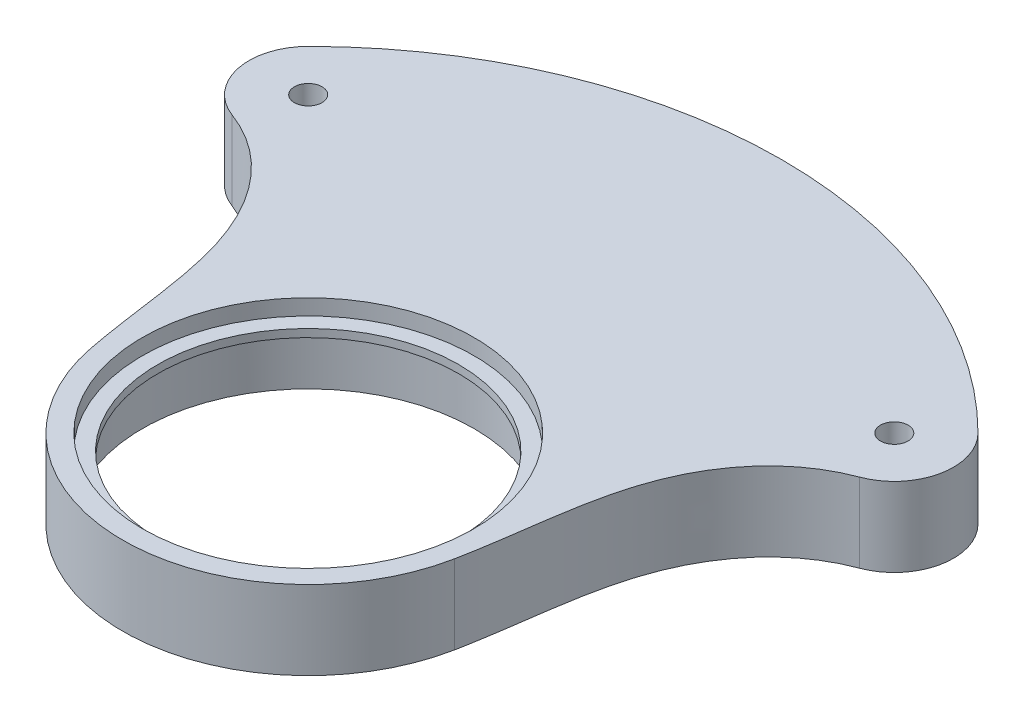
ISO-10303-21;
HEADER;
FILE_DESCRIPTION(('STEP AP214'),'2;1');
FILE_NAME('part.step','',(''),(''),'','','');
FILE_SCHEMA(('AUTOMOTIVE_DESIGN { 1 0 10303 214 1 1 1 1 }'));
ENDSEC;
DATA;
#1=APPLICATION_CONTEXT('core data for automotive mechanical design processes');
#2=APPLICATION_PROTOCOL_DEFINITION('international standard','automotive_design',2000,#1);
#3=PRODUCT_CONTEXT('',#1,'mechanical');
#4=PRODUCT('Part','Part','',(#3));
#5=PRODUCT_RELATED_PRODUCT_CATEGORY('part','',(#4));
#6=PRODUCT_DEFINITION_FORMATION('','',#4);
#7=PRODUCT_DEFINITION_CONTEXT('part definition',#1,'design');
#8=PRODUCT_DEFINITION('design','',#6,#7);
#9=PRODUCT_DEFINITION_SHAPE('','',#8);
#10=(LENGTH_UNIT() NAMED_UNIT(*) SI_UNIT(.MILLI.,.METRE.));
#11=(NAMED_UNIT(*) PLANE_ANGLE_UNIT() SI_UNIT($,.RADIAN.));
#12=(NAMED_UNIT(*) SI_UNIT($,.STERADIAN.) SOLID_ANGLE_UNIT());
#13=UNCERTAINTY_MEASURE_WITH_UNIT(LENGTH_MEASURE(1.E-05),#10,'distance_accuracy_value','');
#14=(GEOMETRIC_REPRESENTATION_CONTEXT(3) GLOBAL_UNCERTAINTY_ASSIGNED_CONTEXT((#13)) GLOBAL_UNIT_ASSIGNED_CONTEXT((#10,
#11,#12)) REPRESENTATION_CONTEXT('',''));
#15=CARTESIAN_POINT('',(0.,0.,0.));
#16=DIRECTION('',(0.,0.,1.));
#17=DIRECTION('',(1.,0.,0.));
#18=AXIS2_PLACEMENT_3D('',#15,#16,#17);
#19=CARTESIAN_POINT('',(0.,10.,0.));
#20=DIRECTION('',(0.,-1.,0.));
#21=DIRECTION('',(0.,0.,-1.));
#22=AXIS2_PLACEMENT_3D('',#19,#20,#21);
#23=CYLINDRICAL_SURFACE('',#22,21.);
#24=CARTESIAN_POINT('',(0.,8.,0.));
#25=DIRECTION('',(0.,1.,0.));
#26=DIRECTION('',(0.,0.,1.));
#27=AXIS2_PLACEMENT_3D('',#24,#25,#26);
#28=CIRCLE('',#27,21.);
#29=CARTESIAN_POINT('',(0.,8.,21.));
#30=VERTEX_POINT('',#29);
#31=EDGE_CURVE('E12',#30,#30,#28,.T.);
#32=ORIENTED_EDGE('',*,*,#31,.F.);
#33=EDGE_LOOP('',(#32));
#34=FACE_BOUND('',#33,.T.);
#35=CARTESIAN_POINT('',(0.,10.,0.));
#36=DIRECTION('',(0.,1.,0.));
#37=DIRECTION('',(0.,0.,1.));
#38=AXIS2_PLACEMENT_3D('',#35,#36,#37);
#39=CIRCLE('',#38,21.);
#40=CARTESIAN_POINT('',(0.,10.,21.));
#41=VERTEX_POINT('',#40);
#42=EDGE_CURVE('E308',#41,#41,#39,.T.);
#43=ORIENTED_EDGE('',*,*,#42,.T.);
#44=EDGE_LOOP('',(#43));
#45=FACE_BOUND('',#44,.T.);
#46=ADVANCED_FACE('F158',(#34,#45),#23,.F.);
#47=CARTESIAN_POINT('',(37.1231060122938,10.,-37.1231060122937));
#48=DIRECTION('',(0.,-1.,0.));
#49=DIRECTION('',(0.,0.,-1.));
#50=AXIS2_PLACEMENT_3D('',#47,#48,#49);
#51=CYLINDRICAL_SURFACE('',#50,7.5);
#52=CARTESIAN_POINT('',(37.1231060122938,0.,-37.1231060122937));
#53=DIRECTION('',(0.,1.,0.));
#54=DIRECTION('',(0.,0.,1.));
#55=AXIS2_PLACEMENT_3D('',#52,#53,#54);
#56=CIRCLE('',#55,7.5);
#57=CARTESIAN_POINT('',(42.4264068711929,0.,-42.4264068711928));
#58=VERTEX_POINT('',#57);
#59=CARTESIAN_POINT('',(39.7420017030734,0.,-30.0952055177778));
#60=VERTEX_POINT('',#59);
#61=EDGE_CURVE('E290',#58,#60,#56,.F.);
#62=ORIENTED_EDGE('',*,*,#61,.F.);
#63=DIRECTION('',(0.,-1.,0.));
#64=VECTOR('',#63,1.);
#65=CARTESIAN_POINT('',(42.4264068711929,10.,-42.4264068711928));
#66=LINE('',#65,#64);
#67=CARTESIAN_POINT('',(42.4264068711929,10.,-42.4264068711928));
#68=VERTEX_POINT('',#67);
#69=EDGE_CURVE('E285',#68,#58,#66,.T.);
#70=ORIENTED_EDGE('',*,*,#69,.F.);
#71=CARTESIAN_POINT('',(37.1231060122938,10.,-37.1231060122937));
#72=DIRECTION('',(0.,1.,0.));
#73=DIRECTION('',(0.,0.,1.));
#74=AXIS2_PLACEMENT_3D('',#71,#72,#73);
#75=CIRCLE('',#74,7.5);
#76=CARTESIAN_POINT('',(39.7420017030734,10.,-30.0952055177778));
#77=VERTEX_POINT('',#76);
#78=EDGE_CURVE('E241',#68,#77,#75,.F.);
#79=ORIENTED_EDGE('',*,*,#78,.T.);
#80=DIRECTION('',(0.,-1.,0.));
#81=VECTOR('',#80,1.);
#82=CARTESIAN_POINT('',(39.7420017030734,10.,-30.0952055177778));
#83=LINE('',#82,#81);
#84=EDGE_CURVE('E204',#77,#60,#83,.T.);
#85=ORIENTED_EDGE('',*,*,#84,.T.);
#86=EDGE_LOOP('',(#62,#70,#79,#85));
#87=FACE_BOUND('',#86,.T.);
#88=ADVANCED_FACE('F264',(#87),#51,.T.);
#89=CARTESIAN_POINT('',(0.,10.,0.));
#90=DIRECTION('',(0.,-1.,0.));
#91=DIRECTION('',(0.,0.,-1.));
#92=AXIS2_PLACEMENT_3D('',#89,#90,#91);
#93=CYLINDRICAL_SURFACE('',#92,60.);
#94=CARTESIAN_POINT('',(0.,0.,0.));
#95=DIRECTION('',(0.,1.,0.));
#96=DIRECTION('',(0.,0.,1.));
#97=AXIS2_PLACEMENT_3D('',#94,#95,#96);
#98=CIRCLE('',#97,60.);
#99=CARTESIAN_POINT('',(-42.4264068711929,0.,-42.4264068711928));
#100=VERTEX_POINT('',#99);
#101=EDGE_CURVE('E294',#58,#100,#98,.T.);
#102=ORIENTED_EDGE('',*,*,#101,.T.);
#103=DIRECTION('',(0.,-1.,0.));
#104=VECTOR('',#103,1.);
#105=CARTESIAN_POINT('',(-42.4264068711929,10.,-42.4264068711928));
#106=LINE('',#105,#104);
#107=CARTESIAN_POINT('',(-42.4264068711929,10.,-42.4264068711928));
#108=VERTEX_POINT('',#107);
#109=EDGE_CURVE('E226',#108,#100,#106,.T.);
#110=ORIENTED_EDGE('',*,*,#109,.F.);
#111=CARTESIAN_POINT('',(0.,10.,0.));
#112=DIRECTION('',(0.,1.,0.));
#113=DIRECTION('',(0.,0.,1.));
#114=AXIS2_PLACEMENT_3D('',#111,#112,#113);
#115=CIRCLE('',#114,60.);
#116=EDGE_CURVE('E235',#68,#108,#115,.T.);
#117=ORIENTED_EDGE('',*,*,#116,.F.);
#118=ORIENTED_EDGE('',*,*,#69,.T.);
#119=EDGE_LOOP('',(#102,#110,#117,#118));
#120=FACE_BOUND('',#119,.T.);
#121=ADVANCED_FACE('F259',(#120),#93,.T.);
#122=CARTESIAN_POINT('',(-39.7420017030734,10.,-30.0952055177778));
#123=CARTESIAN_POINT('',(-34.3086039999246,10.,-28.0704896240095));
#124=CARTESIAN_POINT('',(-24.8133315955259,10.,-17.3717825968528));
#125=CARTESIAN_POINT('',(-24.750821327595,10.,-4.07439581543046));
#126=CARTESIAN_POINT('',(-23.0586272785893,10.,4.53317857877841));
#127=B_SPLINE_CURVE_WITH_KNOTS('',3,(#122,#123,#124,#125,#126),.UNSPECIFIED.,.F.,.F.,(4,1,4),
(0.,0.392292763126498,1.),.UNSPECIFIED.);
#128=DIRECTION('',(0.,-1.,0.));
#129=VECTOR('',#128,1.);
#130=SURFACE_OF_LINEAR_EXTRUSION('',#127,#129);
#131=CARTESIAN_POINT('',(-39.7420017030734,0.,-30.0952055177778));
#132=CARTESIAN_POINT('',(-34.3086039999246,0.,-28.0704896240095));
#133=CARTESIAN_POINT('',(-24.8133315955259,0.,-17.3717825968528));
#134=CARTESIAN_POINT('',(-24.750821327595,0.,-4.07439581543046));
#135=CARTESIAN_POINT('',(-23.0586272785893,0.,4.53317857877841));
#136=B_SPLINE_CURVE_WITH_KNOTS('',3,(#131,#132,#133,#134,#135),.UNSPECIFIED.,.F.,.F.,(4,1,4),
(0.,0.392292763126498,1.),.UNSPECIFIED.);
#137=CARTESIAN_POINT('',(-39.7420017030734,0.,-30.0952055177778));
#138=VERTEX_POINT('',#137);
#139=CARTESIAN_POINT('',(-23.0586272785893,0.,4.53317857877841));
#140=VERTEX_POINT('',#139);
#141=EDGE_CURVE('E277',#138,#140,#136,.T.);
#142=ORIENTED_EDGE('',*,*,#141,.T.);
#143=DIRECTION('',(0.,-1.,0.));
#144=VECTOR('',#143,1.);
#145=CARTESIAN_POINT('',(-23.0586272785893,10.,4.53317857877841));
#146=LINE('',#145,#144);
#147=CARTESIAN_POINT('',(-23.0586272785893,10.,4.53317857877841));
#148=VERTEX_POINT('',#147);
#149=EDGE_CURVE('E195',#148,#140,#146,.T.);
#150=ORIENTED_EDGE('',*,*,#149,.F.);
#151=CARTESIAN_POINT('',(-39.7420017030734,10.,-30.0952055177778));
#152=VERTEX_POINT('',#151);
#153=EDGE_CURVE('E232',#152,#148,#127,.T.);
#154=ORIENTED_EDGE('',*,*,#153,.F.);
#155=DIRECTION('',(0.,-1.,0.));
#156=VECTOR('',#155,1.);
#157=CARTESIAN_POINT('',(-39.7420017030734,10.,-30.0952055177778));
#158=LINE('',#157,#156);
#159=EDGE_CURVE('E215',#152,#138,#158,.T.);
#160=ORIENTED_EDGE('',*,*,#159,.T.);
#161=EDGE_LOOP('',(#142,#150,#154,#160));
#162=FACE_BOUND('',#161,.T.);
#163=ADVANCED_FACE('F238',(#162),#130,.F.);
#164=CARTESIAN_POINT('',(39.7420017030734,10.,-30.0952055177778));
#165=CARTESIAN_POINT('',(34.3086039999246,10.,-28.0704896240095));
#166=CARTESIAN_POINT('',(24.8133315955259,10.,-17.3717825968528));
#167=CARTESIAN_POINT('',(24.750821327595,10.,-4.07439581543046));
#168=CARTESIAN_POINT('',(23.0586272785893,10.,4.53317857877841));
#169=B_SPLINE_CURVE_WITH_KNOTS('',3,(#164,#165,#166,#167,#168),.UNSPECIFIED.,.F.,.F.,(4,1,4),
(0.,0.392292763126498,1.),.UNSPECIFIED.);
#170=DIRECTION('',(0.,-1.,0.));
#171=VECTOR('',#170,1.);
#172=SURFACE_OF_LINEAR_EXTRUSION('',#169,#171);
#173=CARTESIAN_POINT('',(39.7420017030734,0.,-30.0952055177778));
#174=CARTESIAN_POINT('',(34.3086039999246,0.,-28.0704896240095));
#175=CARTESIAN_POINT('',(24.8133315955259,0.,-17.3717825968528));
#176=CARTESIAN_POINT('',(24.750821327595,0.,-4.07439581543046));
#177=CARTESIAN_POINT('',(23.0586272785893,0.,4.53317857877841));
#178=B_SPLINE_CURVE_WITH_KNOTS('',3,(#173,#174,#175,#176,#177),.UNSPECIFIED.,.F.,.F.,(4,1,4),
(0.,0.392292763126498,1.),.UNSPECIFIED.);
#179=CARTESIAN_POINT('',(23.0586272785893,0.,4.53317857877841));
#180=VERTEX_POINT('',#179);
#181=EDGE_CURVE('E236',#60,#180,#178,.T.);
#182=ORIENTED_EDGE('',*,*,#181,.F.);
#183=ORIENTED_EDGE('',*,*,#84,.F.);
#184=CARTESIAN_POINT('',(23.0586272785893,10.,4.53317857877841));
#185=VERTEX_POINT('',#184);
#186=EDGE_CURVE('E272',#77,#185,#169,.T.);
#187=ORIENTED_EDGE('',*,*,#186,.T.);
#188=DIRECTION('',(0.,-1.,0.));
#189=VECTOR('',#188,1.);
#190=CARTESIAN_POINT('',(23.0586272785893,10.,4.53317857877841));
#191=LINE('',#190,#189);
#192=EDGE_CURVE('E175',#185,#180,#191,.T.);
#193=ORIENTED_EDGE('',*,*,#192,.T.);
#194=EDGE_LOOP('',(#182,#183,#187,#193));
#195=FACE_BOUND('',#194,.T.);
#196=ADVANCED_FACE('F258',(#195),#172,.T.);
#197=CARTESIAN_POINT('',(0.,0.,0.));
#198=DIRECTION('',(0.,1.,0.));
#199=DIRECTION('',(0.,0.,1.));
#200=AXIS2_PLACEMENT_3D('',#197,#198,#199);
#201=PLANE('',#200);
#202=CARTESIAN_POINT('',(-37.1231060122938,0.,-37.1231060122937));
#203=DIRECTION('',(0.,1.,0.));
#204=DIRECTION('',(0.,0.,1.));
#205=AXIS2_PLACEMENT_3D('',#202,#203,#204);
#206=CIRCLE('',#205,1.75);
#207=CARTESIAN_POINT('',(-37.1231060122938,0.,-35.3731060122937));
#208=VERTEX_POINT('',#207);
#209=EDGE_CURVE('E315',#208,#208,#206,.F.);
#210=ORIENTED_EDGE('',*,*,#209,.F.);
#211=EDGE_LOOP('',(#210));
#212=FACE_BOUND('',#211,.T.);
#213=CARTESIAN_POINT('',(37.1231060122938,0.,-37.1231060122937));
#214=DIRECTION('',(0.,1.,0.));
#215=DIRECTION('',(0.,0.,1.));
#216=AXIS2_PLACEMENT_3D('',#213,#214,#215);
#217=CIRCLE('',#216,1.75);
#218=CARTESIAN_POINT('',(37.1231060122938,0.,-35.3731060122937));
#219=VERTEX_POINT('',#218);
#220=EDGE_CURVE('E370',#219,#219,#217,.F.);
#221=ORIENTED_EDGE('',*,*,#220,.F.);
#222=EDGE_LOOP('',(#221));
#223=FACE_BOUND('',#222,.T.);
#224=CARTESIAN_POINT('',(-37.1231060122938,0.,-37.1231060122937));
#225=DIRECTION('',(0.,1.,0.));
#226=DIRECTION('',(0.,0.,1.));
#227=AXIS2_PLACEMENT_3D('',#224,#225,#226);
#228=CIRCLE('',#227,7.5);
#229=EDGE_CURVE('E221',#100,#138,#228,.T.);
#230=ORIENTED_EDGE('',*,*,#229,.F.);
#231=ORIENTED_EDGE('',*,*,#101,.F.);
#232=ORIENTED_EDGE('',*,*,#61,.T.);
#233=ORIENTED_EDGE('',*,*,#181,.T.);
#234=CARTESIAN_POINT('',(0.,0.,0.));
#235=DIRECTION('',(0.,1.,0.));
#236=DIRECTION('',(0.,0.,1.));
#237=AXIS2_PLACEMENT_3D('',#234,#235,#236);
#238=CIRCLE('',#237,23.5);
#239=EDGE_CURVE('E311',#140,#180,#238,.T.);
#240=ORIENTED_EDGE('',*,*,#239,.F.);
#241=ORIENTED_EDGE('',*,*,#141,.F.);
#242=EDGE_LOOP('',(#230,#231,#232,#233,#240,#241));
#243=FACE_BOUND('',#242,.T.);
#244=CARTESIAN_POINT('',(0.,0.,0.));
#245=DIRECTION('',(0.,1.,0.));
#246=DIRECTION('',(0.,0.,1.));
#247=AXIS2_PLACEMENT_3D('',#244,#245,#246);
#248=CIRCLE('',#247,21.);
#249=CARTESIAN_POINT('',(0.,0.,21.));
#250=VERTEX_POINT('',#249);
#251=EDGE_CURVE('E312',#250,#250,#248,.T.);
#252=ORIENTED_EDGE('',*,*,#251,.T.);
#253=EDGE_LOOP('',(#252));
#254=FACE_BOUND('',#253,.T.);
#255=ADVANCED_FACE('F260',(#212,#223,#243,#254),#201,.F.);
#256=CARTESIAN_POINT('',(0.,10.,0.));
#257=DIRECTION('',(0.,1.,0.));
#258=DIRECTION('',(0.,0.,1.));
#259=AXIS2_PLACEMENT_3D('',#256,#257,#258);
#260=PLANE('',#259);
#261=CARTESIAN_POINT('',(-37.1231060122938,10.,-37.1231060122937));
#262=DIRECTION('',(0.,1.,0.));
#263=DIRECTION('',(0.,0.,1.));
#264=AXIS2_PLACEMENT_3D('',#261,#262,#263);
#265=CIRCLE('',#264,1.75);
#266=CARTESIAN_POINT('',(-37.1231060122938,10.,-35.3731060122937));
#267=VERTEX_POINT('',#266);
#268=EDGE_CURVE('E372',#267,#267,#265,.T.);
#269=ORIENTED_EDGE('',*,*,#268,.F.);
#270=EDGE_LOOP('',(#269));
#271=FACE_BOUND('',#270,.T.);
#272=CARTESIAN_POINT('',(37.1231060122938,10.,-37.1231060122937));
#273=DIRECTION('',(0.,1.,0.));
#274=DIRECTION('',(0.,0.,-1.));
#275=AXIS2_PLACEMENT_3D('',#272,#273,#274);
#276=CIRCLE('',#275,1.75);
#277=CARTESIAN_POINT('',(37.1231060122938,10.,-38.8731060122937));
#278=VERTEX_POINT('',#277);
#279=EDGE_CURVE('E278',#278,#278,#276,.T.);
#280=ORIENTED_EDGE('',*,*,#279,.F.);
#281=EDGE_LOOP('',(#280));
#282=FACE_BOUND('',#281,.T.);
#283=ORIENTED_EDGE('',*,*,#116,.T.);
#284=CARTESIAN_POINT('',(-37.1231060122938,10.,-37.1231060122937));
#285=DIRECTION('',(0.,1.,0.));
#286=DIRECTION('',(0.,0.,1.));
#287=AXIS2_PLACEMENT_3D('',#284,#285,#286);
#288=CIRCLE('',#287,7.5);
#289=EDGE_CURVE('E218',#108,#152,#288,.T.);
#290=ORIENTED_EDGE('',*,*,#289,.T.);
#291=ORIENTED_EDGE('',*,*,#153,.T.);
#292=CARTESIAN_POINT('',(0.,10.,0.));
#293=DIRECTION('',(0.,1.,0.));
#294=DIRECTION('',(0.,0.,1.));
#295=AXIS2_PLACEMENT_3D('',#292,#293,#294);
#296=CIRCLE('',#295,23.5);
#297=EDGE_CURVE('E286',#148,#185,#296,.T.);
#298=ORIENTED_EDGE('',*,*,#297,.T.);
#299=ORIENTED_EDGE('',*,*,#186,.F.);
#300=ORIENTED_EDGE('',*,*,#78,.F.);
#301=EDGE_LOOP('',(#283,#290,#291,#298,#299,#300));
#302=FACE_BOUND('',#301,.T.);
#303=ORIENTED_EDGE('',*,*,#42,.F.);
#304=EDGE_LOOP('',(#303));
#305=FACE_BOUND('',#304,.T.);
#306=ADVANCED_FACE('F230',(#271,#282,#302,#305),#260,.T.);
#307=CARTESIAN_POINT('',(0.,7.,0.));
#308=DIRECTION('',(0.,-1.,0.));
#309=DIRECTION('',(0.,0.,-1.));
#310=AXIS2_PLACEMENT_3D('',#307,#308,#309);
#311=CIRCLE('',#310,21.);
#312=CARTESIAN_POINT('',(0.,7.,-21.));
#313=VERTEX_POINT('',#312);
#314=EDGE_CURVE('E167',#313,#313,#311,.T.);
#315=ORIENTED_EDGE('',*,*,#314,.F.);
#316=EDGE_LOOP('',(#315));
#317=FACE_BOUND('',#316,.T.);
#318=ORIENTED_EDGE('',*,*,#251,.F.);
#319=EDGE_LOOP('',(#318));
#320=FACE_BOUND('',#319,.T.);
#321=ADVANCED_FACE('F322',(#317,#320),#23,.F.);
#322=CARTESIAN_POINT('',(0.,10.,0.));
#323=DIRECTION('',(0.,-1.,0.));
#324=DIRECTION('',(0.,0.,-1.));
#325=AXIS2_PLACEMENT_3D('',#322,#323,#324);
#326=CYLINDRICAL_SURFACE('',#325,23.5);
#327=ORIENTED_EDGE('',*,*,#192,.F.);
#328=ORIENTED_EDGE('',*,*,#297,.F.);
#329=ORIENTED_EDGE('',*,*,#149,.T.);
#330=ORIENTED_EDGE('',*,*,#239,.T.);
#331=EDGE_LOOP('',(#327,#328,#329,#330));
#332=FACE_BOUND('',#331,.T.);
#333=ADVANCED_FACE('F160',(#332),#326,.T.);
#334=CARTESIAN_POINT('',(-37.1231060122938,10.,-37.1231060122937));
#335=DIRECTION('',(0.,-1.,0.));
#336=DIRECTION('',(0.,0.,-1.));
#337=AXIS2_PLACEMENT_3D('',#334,#335,#336);
#338=CYLINDRICAL_SURFACE('',#337,7.5);
#339=ORIENTED_EDGE('',*,*,#159,.F.);
#340=ORIENTED_EDGE('',*,*,#289,.F.);
#341=ORIENTED_EDGE('',*,*,#109,.T.);
#342=ORIENTED_EDGE('',*,*,#229,.T.);
#343=EDGE_LOOP('',(#339,#340,#341,#342));
#344=FACE_BOUND('',#343,.T.);
#345=ADVANCED_FACE('F217',(#344),#338,.T.);
#346=CARTESIAN_POINT('',(37.1231060122938,-0.000999999999999265,-37.1231060122937));
#347=DIRECTION('',(0.,1.,0.));
#348=DIRECTION('',(0.,0.,1.));
#349=AXIS2_PLACEMENT_3D('',#346,#347,#348);
#350=CYLINDRICAL_SURFACE('',#349,1.75);
#351=ORIENTED_EDGE('',*,*,#279,.T.);
#352=EDGE_LOOP('',(#351));
#353=FACE_BOUND('',#352,.T.);
#354=ORIENTED_EDGE('',*,*,#220,.T.);
#355=EDGE_LOOP('',(#354));
#356=FACE_BOUND('',#355,.T.);
#357=ADVANCED_FACE('F355',(#353,#356),#350,.F.);
#358=CARTESIAN_POINT('',(-37.1231060122938,-0.000999999999999265,-37.1231060122937));
#359=DIRECTION('',(0.,1.,0.));
#360=DIRECTION('',(0.,0.,1.));
#361=AXIS2_PLACEMENT_3D('',#358,#359,#360);
#362=CYLINDRICAL_SURFACE('',#361,1.75);
#363=ORIENTED_EDGE('',*,*,#268,.T.);
#364=EDGE_LOOP('',(#363));
#365=FACE_BOUND('',#364,.T.);
#366=ORIENTED_EDGE('',*,*,#209,.T.);
#367=EDGE_LOOP('',(#366));
#368=FACE_BOUND('',#367,.T.);
#369=ADVANCED_FACE('F346',(#365,#368),#362,.F.);
#370=CARTESIAN_POINT('',(-23.0586272785893,8.,0.));
#371=DIRECTION('',(0.,1.,0.));
#372=DIRECTION('',(0.,0.,1.));
#373=AXIS2_PLACEMENT_3D('',#370,#371,#372);
#374=PLANE('',#373);
#375=CARTESIAN_POINT('',(0.,8.,0.));
#376=DIRECTION('',(0.,1.,0.));
#377=DIRECTION('',(0.,0.,1.));
#378=AXIS2_PLACEMENT_3D('',#375,#376,#377);
#379=CIRCLE('',#378,19.0586272785893);
#380=CARTESIAN_POINT('',(0.,8.,19.0586272785893));
#381=VERTEX_POINT('',#380);
#382=EDGE_CURVE('E371',#381,#381,#379,.T.);
#383=ORIENTED_EDGE('',*,*,#382,.F.);
#384=EDGE_LOOP('',(#383));
#385=FACE_BOUND('',#384,.T.);
#386=ORIENTED_EDGE('',*,*,#31,.T.);
#387=EDGE_LOOP('',(#386));
#388=FACE_BOUND('',#387,.T.);
#389=ADVANCED_FACE('F344',(#385,#388),#374,.T.);
#390=CARTESIAN_POINT('',(-23.0586272785893,7.,0.));
#391=DIRECTION('',(0.,-1.,0.));
#392=DIRECTION('',(0.,0.,-1.));
#393=AXIS2_PLACEMENT_3D('',#390,#391,#392);
#394=PLANE('',#393);
#395=CARTESIAN_POINT('',(0.,7.,0.));
#396=DIRECTION('',(0.,1.,0.));
#397=DIRECTION('',(0.,0.,1.));
#398=AXIS2_PLACEMENT_3D('',#395,#396,#397);
#399=CIRCLE('',#398,19.0586272785893);
#400=CARTESIAN_POINT('',(0.,7.,19.0586272785893));
#401=VERTEX_POINT('',#400);
#402=EDGE_CURVE('E374',#401,#401,#399,.T.);
#403=ORIENTED_EDGE('',*,*,#402,.T.);
#404=EDGE_LOOP('',(#403));
#405=FACE_BOUND('',#404,.T.);
#406=ORIENTED_EDGE('',*,*,#314,.T.);
#407=EDGE_LOOP('',(#406));
#408=FACE_BOUND('',#407,.T.);
#409=ADVANCED_FACE('F320',(#405,#408),#394,.T.);
#410=CARTESIAN_POINT('',(0.,10.,0.));
#411=DIRECTION('',(0.,1.,0.));
#412=DIRECTION('',(0.,0.,1.));
#413=AXIS2_PLACEMENT_3D('',#410,#411,#412);
#414=CYLINDRICAL_SURFACE('',#413,19.0586272785893);
#415=ORIENTED_EDGE('',*,*,#382,.T.);
#416=EDGE_LOOP('',(#415));
#417=FACE_BOUND('',#416,.T.);
#418=ORIENTED_EDGE('',*,*,#402,.F.);
#419=EDGE_LOOP('',(#418));
#420=FACE_BOUND('',#419,.T.);
#421=ADVANCED_FACE('F352',(#417,#420),#414,.F.);
#422=CLOSED_SHELL('',(#46,#88,#121,#163,#196,#255,#306,#321,#333,#345,#357,#369,#389,#409,#421));
#423=MANIFOLD_SOLID_BREP('B2',#422);
#424=ADVANCED_BREP_SHAPE_REPRESENTATION('',(#18,#423),#14);
#425=SHAPE_DEFINITION_REPRESENTATION(#9,#424);
ENDSEC;
END-ISO-10303-21;
